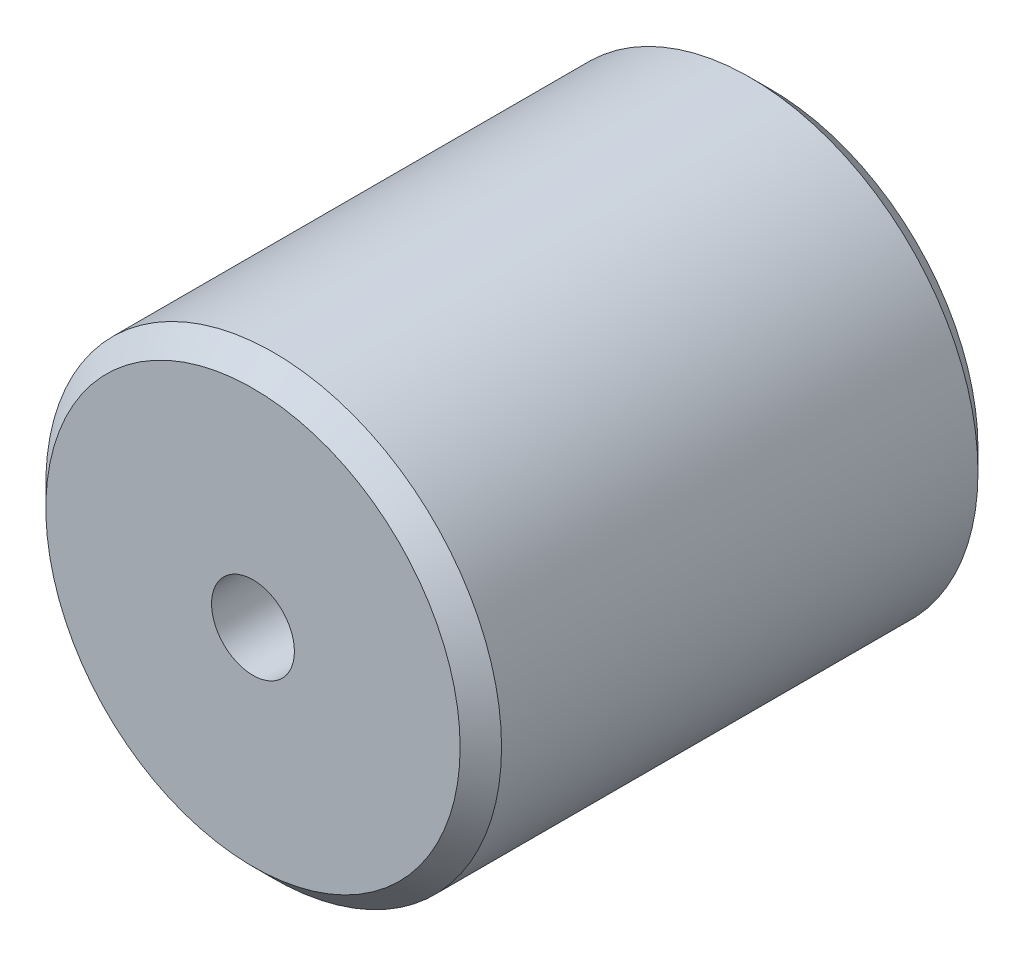
ISO-10303-21;
HEADER;
FILE_DESCRIPTION(('STEP AP214'),'2;1');
FILE_NAME('part.step','',(''),(''),'','','');
FILE_SCHEMA(('AUTOMOTIVE_DESIGN { 1 0 10303 214 1 1 1 1 }'));
ENDSEC;
DATA;
#1=APPLICATION_CONTEXT('core data for automotive mechanical design processes');
#2=APPLICATION_PROTOCOL_DEFINITION('international standard','automotive_design',2000,#1);
#3=PRODUCT_CONTEXT('',#1,'mechanical');
#4=PRODUCT('Part','Part','',(#3));
#5=PRODUCT_RELATED_PRODUCT_CATEGORY('part','',(#4));
#6=PRODUCT_DEFINITION_FORMATION('','',#4);
#7=PRODUCT_DEFINITION_CONTEXT('part definition',#1,'design');
#8=PRODUCT_DEFINITION('design','',#6,#7);
#9=PRODUCT_DEFINITION_SHAPE('','',#8);
#10=(LENGTH_UNIT() NAMED_UNIT(*) SI_UNIT(.MILLI.,.METRE.));
#11=(NAMED_UNIT(*) PLANE_ANGLE_UNIT() SI_UNIT($,.RADIAN.));
#12=(NAMED_UNIT(*) SI_UNIT($,.STERADIAN.) SOLID_ANGLE_UNIT());
#13=UNCERTAINTY_MEASURE_WITH_UNIT(LENGTH_MEASURE(1.E-05),#10,'distance_accuracy_value','');
#14=(GEOMETRIC_REPRESENTATION_CONTEXT(3) GLOBAL_UNCERTAINTY_ASSIGNED_CONTEXT((#13)) GLOBAL_UNIT_ASSIGNED_CONTEXT((#10,
#11,#12)) REPRESENTATION_CONTEXT('',''));
#15=CARTESIAN_POINT('',(0.,0.,0.));
#16=DIRECTION('',(0.,0.,1.));
#17=DIRECTION('',(1.,0.,0.));
#18=AXIS2_PLACEMENT_3D('',#15,#16,#17);
#19=CARTESIAN_POINT('',(0.,0.,25.));
#20=DIRECTION('',(0.,0.,1.));
#21=DIRECTION('',(1.,0.,0.));
#22=AXIS2_PLACEMENT_3D('',#19,#20,#21);
#23=PLANE('',#22);
#24=CARTESIAN_POINT('',(0.,0.,25.));
#25=DIRECTION('',(0.,0.,1.));
#26=DIRECTION('',(1.,0.,0.));
#27=AXIS2_PLACEMENT_3D('',#24,#25,#26);
#28=CIRCLE('',#27,10.);
#29=CARTESIAN_POINT('',(10.,0.,25.));
#30=VERTEX_POINT('',#29);
#31=EDGE_CURVE('E10',#30,#30,#28,.T.);
#32=ORIENTED_EDGE('',*,*,#31,.T.);
#33=EDGE_LOOP('',(#32));
#34=FACE_BOUND('',#33,.T.);
#35=CARTESIAN_POINT('',(0.,0.,25.));
#36=DIRECTION('',(0.,0.,1.));
#37=DIRECTION('',(1.,0.,0.));
#38=AXIS2_PLACEMENT_3D('',#35,#36,#37);
#39=CIRCLE('',#38,2.);
#40=CARTESIAN_POINT('',(2.,0.,25.));
#41=VERTEX_POINT('',#40);
#42=EDGE_CURVE('E53',#41,#41,#39,.T.);
#43=ORIENTED_EDGE('',*,*,#42,.F.);
#44=EDGE_LOOP('',(#43));
#45=FACE_BOUND('',#44,.T.);
#46=ADVANCED_FACE('F33',(#34,#45),#23,.T.);
#47=CARTESIAN_POINT('',(0.,0.,0.));
#48=DIRECTION('',(0.,0.,1.));
#49=DIRECTION('',(1.,0.,0.));
#50=AXIS2_PLACEMENT_3D('',#47,#48,#49);
#51=PLANE('',#50);
#52=CARTESIAN_POINT('',(0.,0.,0.));
#53=DIRECTION('',(0.,0.,1.));
#54=DIRECTION('',(1.,0.,0.));
#55=AXIS2_PLACEMENT_3D('',#52,#53,#54);
#56=CIRCLE('',#55,10.);
#57=CARTESIAN_POINT('',(10.,0.,0.));
#58=VERTEX_POINT('',#57);
#59=EDGE_CURVE('E40',#58,#58,#56,.F.);
#60=ORIENTED_EDGE('',*,*,#59,.T.);
#61=EDGE_LOOP('',(#60));
#62=FACE_BOUND('',#61,.T.);
#63=CARTESIAN_POINT('',(0.,0.,0.));
#64=DIRECTION('',(0.,0.,1.));
#65=DIRECTION('',(1.,0.,0.));
#66=AXIS2_PLACEMENT_3D('',#63,#64,#65);
#67=CIRCLE('',#66,2.);
#68=CARTESIAN_POINT('',(2.,0.,0.));
#69=VERTEX_POINT('',#68);
#70=EDGE_CURVE('E54',#69,#69,#67,.T.);
#71=ORIENTED_EDGE('',*,*,#70,.T.);
#72=EDGE_LOOP('',(#71));
#73=FACE_BOUND('',#72,.T.);
#74=ADVANCED_FACE('F64',(#62,#73),#51,.F.);
#75=CARTESIAN_POINT('',(0.,0.,25.));
#76=DIRECTION('',(0.,0.,-1.));
#77=DIRECTION('',(-1.,0.,0.));
#78=AXIS2_PLACEMENT_3D('',#75,#76,#77);
#79=CYLINDRICAL_SURFACE('',#78,11.);
#80=CARTESIAN_POINT('',(0.,0.,0.999999999999994));
#81=DIRECTION('',(0.,0.,1.));
#82=DIRECTION('',(1.,0.,0.));
#83=AXIS2_PLACEMENT_3D('',#80,#81,#82);
#84=CIRCLE('',#83,11.);
#85=CARTESIAN_POINT('',(11.,0.,0.999999999999994));
#86=VERTEX_POINT('',#85);
#87=EDGE_CURVE('E44',#86,#86,#84,.T.);
#88=ORIENTED_EDGE('',*,*,#87,.T.);
#89=EDGE_LOOP('',(#88));
#90=FACE_BOUND('',#89,.T.);
#91=CARTESIAN_POINT('',(0.,0.,24.));
#92=DIRECTION('',(0.,0.,1.));
#93=DIRECTION('',(1.,0.,0.));
#94=AXIS2_PLACEMENT_3D('',#91,#92,#93);
#95=CIRCLE('',#94,11.);
#96=CARTESIAN_POINT('',(11.,0.,24.));
#97=VERTEX_POINT('',#96);
#98=EDGE_CURVE('E48',#97,#97,#95,.F.);
#99=ORIENTED_EDGE('',*,*,#98,.T.);
#100=EDGE_LOOP('',(#99));
#101=FACE_BOUND('',#100,.T.);
#102=ADVANCED_FACE('F69',(#90,#101),#79,.T.);
#103=CARTESIAN_POINT('',(0.,0.,25.));
#104=DIRECTION('',(0.,0.,-1.));
#105=DIRECTION('',(-1.,0.,0.));
#106=AXIS2_PLACEMENT_3D('',#103,#104,#105);
#107=CYLINDRICAL_SURFACE('',#106,2.);
#108=ORIENTED_EDGE('',*,*,#42,.T.);
#109=EDGE_LOOP('',(#108));
#110=FACE_BOUND('',#109,.T.);
#111=ORIENTED_EDGE('',*,*,#70,.F.);
#112=EDGE_LOOP('',(#111));
#113=FACE_BOUND('',#112,.T.);
#114=ADVANCED_FACE('F60',(#110,#113),#107,.F.);
#115=CARTESIAN_POINT('',(0.,0.,0.999999999999994));
#116=DIRECTION('',(0.,0.,1.));
#117=DIRECTION('',(1.,0.,0.));
#118=AXIS2_PLACEMENT_3D('',#115,#116,#117);
#119=CONICAL_SURFACE('',#118,11.,0.785398163397452);
#120=ORIENTED_EDGE('',*,*,#59,.F.);
#121=EDGE_LOOP('',(#120));
#122=FACE_BOUND('',#121,.T.);
#123=ORIENTED_EDGE('',*,*,#87,.F.);
#124=EDGE_LOOP('',(#123));
#125=FACE_BOUND('',#124,.T.);
#126=ADVANCED_FACE('F75',(#122,#125),#119,.T.);
#127=CARTESIAN_POINT('',(0.,0.,25.));
#128=DIRECTION('',(0.,0.,-1.));
#129=DIRECTION('',(-1.,0.,0.));
#130=AXIS2_PLACEMENT_3D('',#127,#128,#129);
#131=CONICAL_SURFACE('',#130,10.,0.785398163397445);
#132=ORIENTED_EDGE('',*,*,#98,.F.);
#133=EDGE_LOOP('',(#132));
#134=FACE_BOUND('',#133,.T.);
#135=ORIENTED_EDGE('',*,*,#31,.F.);
#136=EDGE_LOOP('',(#135));
#137=FACE_BOUND('',#136,.T.);
#138=ADVANCED_FACE('F35',(#134,#137),#131,.T.);
#139=CLOSED_SHELL('',(#46,#74,#102,#114,#126,#138));
#140=MANIFOLD_SOLID_BREP('B2',#139);
#141=ADVANCED_BREP_SHAPE_REPRESENTATION('',(#18,#140),#14);
#142=SHAPE_DEFINITION_REPRESENTATION(#9,#141);
ENDSEC;
END-ISO-10303-21;
